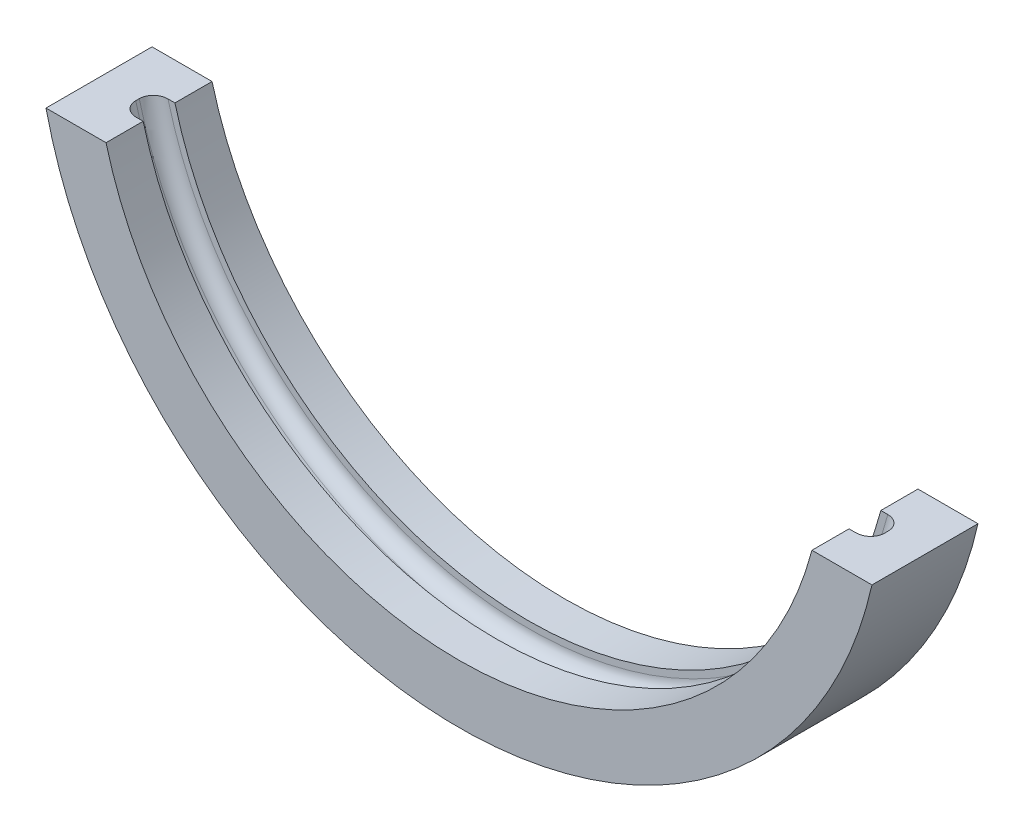
ISO-10303-21;
HEADER;
FILE_DESCRIPTION(('STEP AP214'),'2;1');
FILE_NAME('part.step','',(''),(''),'','','');
FILE_SCHEMA(('AUTOMOTIVE_DESIGN { 1 0 10303 214 1 1 1 1 }'));
ENDSEC;
DATA;
#1=APPLICATION_CONTEXT('core data for automotive mechanical design processes');
#2=APPLICATION_PROTOCOL_DEFINITION('international standard','automotive_design',2000,#1);
#3=PRODUCT_CONTEXT('',#1,'mechanical');
#4=PRODUCT('Part','Part','',(#3));
#5=PRODUCT_RELATED_PRODUCT_CATEGORY('part','',(#4));
#6=PRODUCT_DEFINITION_FORMATION('','',#4);
#7=PRODUCT_DEFINITION_CONTEXT('part definition',#1,'design');
#8=PRODUCT_DEFINITION('design','',#6,#7);
#9=PRODUCT_DEFINITION_SHAPE('','',#8);
#10=(LENGTH_UNIT() NAMED_UNIT(*) SI_UNIT(.MILLI.,.METRE.));
#11=(NAMED_UNIT(*) PLANE_ANGLE_UNIT() SI_UNIT($,.RADIAN.));
#12=(NAMED_UNIT(*) SI_UNIT($,.STERADIAN.) SOLID_ANGLE_UNIT());
#13=UNCERTAINTY_MEASURE_WITH_UNIT(LENGTH_MEASURE(1.E-05),#10,'distance_accuracy_value','');
#14=(GEOMETRIC_REPRESENTATION_CONTEXT(3) GLOBAL_UNCERTAINTY_ASSIGNED_CONTEXT((#13)) GLOBAL_UNIT_ASSIGNED_CONTEXT((#10,
#11,#12)) REPRESENTATION_CONTEXT('',''));
#15=CARTESIAN_POINT('',(0.,0.,0.));
#16=DIRECTION('',(0.,0.,1.));
#17=DIRECTION('',(1.,0.,0.));
#18=AXIS2_PLACEMENT_3D('',#15,#16,#17);
#19=CARTESIAN_POINT('',(0.,76.073,5.715));
#20=DIRECTION('',(0.,0.,-1.));
#21=DIRECTION('',(-1.,0.,0.));
#22=AXIS2_PLACEMENT_3D('',#19,#20,#21);
#23=CYLINDRICAL_SURFACE('',#22,76.073);
#24=CARTESIAN_POINT('',(0.,0.,1.33349999999999));
#25=CARTESIAN_POINT('',(0.0855945349997394,2.06101865915867E-07,1.33350379291589));
#26=CARTESIAN_POINT('',(0.171250915498614,0.000146012248360919,1.34073524768457));
#27=CARTESIAN_POINT('',(0.340204023150751,0.00071364506222568,1.36948225182749));
#28=CARTESIAN_POINT('',(0.423497794593289,0.00113580282824444,1.39101493604841));
#29=CARTESIAN_POINT('',(0.58525356893735,0.00220832220925467,1.44775060002442));
#30=CARTESIAN_POINT('',(0.663717883442069,0.00285857363366933,1.48294697981084));
#31=CARTESIAN_POINT('',(0.813602096244806,0.0043138981059449,1.56600169332678));
#32=CARTESIAN_POINT('',(0.885023725956289,0.00511893295668781,1.61385690423012));
#33=CARTESIAN_POINT('',(1.01883757249064,0.00679340697851409,1.72088761442366));
#34=CARTESIAN_POINT('',(1.08122770917481,0.00766286091714674,1.78006571434437));
#35=CARTESIAN_POINT('',(1.19519031708527,0.0093680471323975,1.90805861859076));
#36=CARTESIAN_POINT('',(1.24676236082598,0.010203778075371,1.97687380355443));
#37=CARTESIAN_POINT('',(1.3376251451231,0.0117473104519163,2.12219141461824));
#38=CARTESIAN_POINT('',(1.37691508154246,0.0124551035078293,2.19869434361906));
#39=CARTESIAN_POINT('',(1.44209293399731,0.0136628632197349,2.35721212766005));
#40=CARTESIAN_POINT('',(1.46798088892473,0.0141628304788274,2.43922696670414));
#41=CARTESIAN_POINT('',(1.50561666142446,0.0148984887564408,2.60642887018513));
#42=CARTESIAN_POINT('',(1.51736637556974,0.0151342152212277,2.69161550756052));
#43=CARTESIAN_POINT('',(1.52639796106279,0.0153149207245114,2.8627524189173));
#44=CARTESIAN_POINT('',(1.52367987260578,0.0152599005707755,2.94870269077645));
#45=CARTESIAN_POINT('',(1.50385466040848,0.0148653504340099,3.11891417148759));
#46=CARTESIAN_POINT('',(1.48674959902126,0.0145258612292591,3.20317562065764));
#47=CARTESIAN_POINT('',(1.43863917290202,0.0136007098296155,3.3676307436008));
#48=CARTESIAN_POINT('',(1.40763378638577,0.0130150472489263,3.44782441099877));
#49=CARTESIAN_POINT('',(1.33260048235792,0.0116635275432489,3.60187411392825));
#50=CARTESIAN_POINT('',(1.28857161888797,0.0108976573297322,3.67572968859041));
#51=CARTESIAN_POINT('',(1.18874191287519,0.00927207813996294,3.81500161578621));
#52=CARTESIAN_POINT('',(1.13294106097371,0.00841236908910922,3.88041796161065));
#53=CARTESIAN_POINT('',(1.01113968026977,0.00669585093085855,4.00096653225274));
#54=CARTESIAN_POINT('',(0.945137359360457,0.0058390423600706,4.05609694636289));
#55=CARTESIAN_POINT('',(0.804812955805773,0.00422506510297776,4.15449474589157));
#56=CARTESIAN_POINT('',(0.730490871968146,0.00346789643095172,4.19776212961007));
#57=CARTESIAN_POINT('',(0.575635722257035,0.00213855432188997,4.27120543008588));
#58=CARTESIAN_POINT('',(0.495102630444092,0.00156638165751761,4.30138129216468));
#59=CARTESIAN_POINT('',(0.330111987568197,0.000671548269268094,4.34778380786271));
#60=CARTESIAN_POINT('',(0.245654441366153,0.000348887236349569,4.3640104787592));
#61=CARTESIAN_POINT('',(0.0752280970382326,-1.05092405947312E-05,4.38205177674906));
#62=CARTESIAN_POINT('',(-0.0107404358431765,-4.72943757394238E-05,4.38386890851823));
#63=CARTESIAN_POINT('',(-0.181762198594427,0.000169076345192388,4.37304606986865));
#64=CARTESIAN_POINT('',(-0.266815428914038,0.000422232058788883,4.36040610655427));
#65=CARTESIAN_POINT('',(-0.433585227687398,0.0011899157446135,4.32102995718912));
#66=CARTESIAN_POINT('',(-0.515302064212906,0.00170442267303155,4.29429490605803));
#67=CARTESIAN_POINT('',(-0.673087615387558,0.00293681524962359,4.22748865692274));
#68=CARTESIAN_POINT('',(-0.749156325373015,0.00365470106572617,4.18741744790695));
#69=CARTESIAN_POINT('',(-0.893497817923817,0.00521306827912535,4.09506991635602));
#70=CARTESIAN_POINT('',(-0.961769521065522,0.00605356661440183,4.04279190694471));
#71=CARTESIAN_POINT('',(-1.08856816644544,0.00776235857443175,3.92751724418561));
#72=CARTESIAN_POINT('',(-1.14709509541133,0.00863065223704034,3.86452057623931));
#73=CARTESIAN_POINT('',(-1.25275113682792,0.0102972860680389,3.72958614285633));
#74=CARTESIAN_POINT('',(-1.2998786325906,0.0110956163038644,3.65764711138529));
#75=CARTESIAN_POINT('',(-1.38138693581098,0.012532160014725,3.50687658683567));
#76=CARTESIAN_POINT('',(-1.41576776354565,0.0131703737444674,3.4280451047216));
#77=CARTESIAN_POINT('',(-1.47080396987324,0.0142146587671107,3.26573353617285));
#78=CARTESIAN_POINT('',(-1.49146040078931,0.0146207478579197,3.18225380667632));
#79=CARTESIAN_POINT('',(-1.51846491163559,0.015155049642882,3.01301030152232));
#80=CARTESIAN_POINT('',(-1.52481298287515,0.0152832621682579,2.92724652447759));
#81=CARTESIAN_POINT('',(-1.5230204201675,0.0152473484650301,2.75588581915875));
#82=CARTESIAN_POINT('',(-1.51488234856612,0.0150832739369008,2.67028886405773));
#83=CARTESIAN_POINT('',(-1.4843537508379,0.0144813917127718,2.50167631198362));
#84=CARTESIAN_POINT('',(-1.46196319621411,0.0140435834694591,2.41866072017216));
#85=CARTESIAN_POINT('',(-1.40356528137836,0.0129435925449101,2.25756570290613));
#86=CARTESIAN_POINT('',(-1.36755767518963,0.0122814058105504,2.17948636664921));
#87=CARTESIAN_POINT('',(-1.28294952090296,0.0108073427394373,2.03048353282782));
#88=CARTESIAN_POINT('',(-1.23434944982934,0.00999547207330576,1.95955976433944));
#89=CARTESIAN_POINT('',(-1.12593166801518,0.00831346202115557,1.82687158382607));
#90=CARTESIAN_POINT('',(-1.06611316687766,0.00744331853229102,1.76510781772051));
#91=CARTESIAN_POINT('',(-0.936938606354715,0.00574266821983038,1.65248329537931));
#92=CARTESIAN_POINT('',(-0.867580184106196,0.00491217128481854,1.60162524830068));
#93=CARTESIAN_POINT('',(-0.721275855637611,0.00338424251398353,1.51225182287018));
#94=CARTESIAN_POINT('',(-0.644325772223447,0.00268688456219293,1.47374328973678));
#95=CARTESIAN_POINT('',(-0.485111216277927,0.00150529078577328,1.41023637854843));
#96=CARTESIAN_POINT('',(-0.402853232344317,0.00102080019868899,1.38522184248434));
#97=CARTESIAN_POINT('',(-0.266727553014035,0.00044943552346389,1.35606306091305));
#98=CARTESIAN_POINT('',(-0.213743956090708,0.000281625570785505,1.34761251136189));
#99=CARTESIAN_POINT('',(-0.10718165758212,5.68432813400188E-05,1.33632979362654));
#100=CARTESIAN_POINT('',(-0.0536029560740152,-1.29069797102052E-07,1.33349762471394));
#101=CARTESIAN_POINT('',(0.,0.,1.33349999999999));
#102=B_SPLINE_CURVE_WITH_KNOTS('',3,(#24,#25,#26,#27,#28,#29,#30,#31,#32,#33,#34,#35,#36,#37,
#38,#39,#40,#41,#42,#43,#44,#45,#46,#47,#48,#49,#50,#51,#52,#53,#54,#55,#56,#57,#58,#59,#60,#61,
#62,#63,#64,#65,#66,#67,#68,#69,#70,#71,#72,#73,#74,#75,#76,#77,#78,#79,#80,#81,#82,#83,#84,#85,
#86,#87,#88,#89,#90,#91,#92,#93,#94,#95,#96,#97,#98,#99,#100,#101),.UNSPECIFIED.,.T.,.F.,(4,2,2,
2,2,2,2,2,2,2,2,2,2,2,2,2,2,2,2,2,2,2,2,2,2,2,2,2,2,2,2,2,2,2,2,2,2,2,4),(0.,0.256587951195914,
0.513483886104433,0.770255886772825,1.02696460294593,1.28373235066598,1.5405102428578,
1.79730494335351,2.0540988986388,2.31085840248152,2.56761719298187,2.82433918372928,
3.08106157680606,3.33780262145724,3.59454387021671,3.85133027245316,4.10811671148822,
4.36490422301619,4.62169141649049,4.87843397406325,5.13517640547004,5.3918981674388,
5.64862014138162,5.90537761313974,6.16213543459716,6.41892964858623,6.67572345407407,
6.9324975675299,7.18927183694585,7.44600069198828,7.70273006034533,7.95946406645213,
8.21618834845273,8.47293072481965,8.72973680644864,8.98668498820558,9.2433248077216,
9.40401117000277,9.56469751145107),.UNSPECIFIED.);
#103=CARTESIAN_POINT('',(0.,0.,1.33349999999999));
#104=VERTEX_POINT('',#103);
#105=EDGE_CURVE('E173',#104,#104,#102,.T.);
#106=ORIENTED_EDGE('',*,*,#105,.F.);
#107=EDGE_LOOP('',(#106));
#108=FACE_BOUND('',#107,.T.);
#109=CARTESIAN_POINT('',(0.,76.073,12.3825));
#110=DIRECTION('',(0.,0.,1.));
#111=DIRECTION('',(1.,0.,0.));
#112=AXIS2_PLACEMENT_3D('',#109,#110,#111);
#113=CIRCLE('',#112,76.073);
#114=CARTESIAN_POINT('',(-74.2028950446005,59.3090000000001,12.3825));
#115=VERTEX_POINT('',#114);
#116=CARTESIAN_POINT('',(74.2028950446005,59.309,12.3825));
#117=VERTEX_POINT('',#116);
#118=EDGE_CURVE('E156',#115,#117,#113,.T.);
#119=ORIENTED_EDGE('',*,*,#118,.F.);
#120=DIRECTION('',(0.,0.,1.));
#121=VECTOR('',#120,1.);
#122=CARTESIAN_POINT('',(-74.2028950446005,59.3090000000001,-6.6675));
#123=LINE('',#122,#121);
#124=CARTESIAN_POINT('',(-74.2028950446005,59.3090000000001,-6.6675));
#125=VERTEX_POINT('',#124);
#126=EDGE_CURVE('E128',#125,#115,#123,.T.);
#127=ORIENTED_EDGE('',*,*,#126,.F.);
#128=CARTESIAN_POINT('',(0.,76.073,-6.6675));
#129=DIRECTION('',(0.,0.,-1.));
#130=DIRECTION('',(-1.,0.,0.));
#131=AXIS2_PLACEMENT_3D('',#128,#129,#130);
#132=CIRCLE('',#131,76.073);
#133=CARTESIAN_POINT('',(74.2028950446005,59.309,-6.6675));
#134=VERTEX_POINT('',#133);
#135=EDGE_CURVE('E138',#134,#125,#132,.T.);
#136=ORIENTED_EDGE('',*,*,#135,.F.);
#137=DIRECTION('',(0.,0.,1.));
#138=VECTOR('',#137,1.);
#139=CARTESIAN_POINT('',(74.2028950446005,59.309,-6.6675));
#140=LINE('',#139,#138);
#141=EDGE_CURVE('E227',#134,#117,#140,.T.);
#142=ORIENTED_EDGE('',*,*,#141,.T.);
#143=EDGE_LOOP('',(#119,#127,#136,#142));
#144=FACE_BOUND('',#143,.T.);
#145=ADVANCED_FACE('F38',(#108,#144),#23,.T.);
#146=CARTESIAN_POINT('',(0.,76.073,5.715));
#147=DIRECTION('',(0.,0.,-1.));
#148=DIRECTION('',(-1.,0.,0.));
#149=AXIS2_PLACEMENT_3D('',#146,#147,#148);
#150=CYLINDRICAL_SURFACE('',#149,69.342);
#151=DIRECTION('',(0.,0.,-1.));
#152=VECTOR('',#151,1.);
#153=CARTESIAN_POINT('',(-67.2850746302626,59.3090000000001,5.715));
#154=LINE('',#153,#152);
#155=CARTESIAN_POINT('',(-67.2850746302626,59.3090000000001,3.175));
#156=VERTEX_POINT('',#155);
#157=CARTESIAN_POINT('',(-67.2850746302626,59.3090000000001,2.54));
#158=VERTEX_POINT('',#157);
#159=EDGE_CURVE('E66',#156,#158,#154,.T.);
#160=ORIENTED_EDGE('',*,*,#159,.F.);
#161=CARTESIAN_POINT('',(0.,76.073,3.175));
#162=DIRECTION('',(0.,0.,1.));
#163=DIRECTION('',(1.,0.,0.));
#164=AXIS2_PLACEMENT_3D('',#161,#162,#163);
#165=CIRCLE('',#164,69.342);
#166=CARTESIAN_POINT('',(67.2850746302626,59.309,3.175));
#167=VERTEX_POINT('',#166);
#168=EDGE_CURVE('E164',#156,#167,#165,.T.);
#169=ORIENTED_EDGE('',*,*,#168,.T.);
#170=DIRECTION('',(0.,0.,-1.));
#171=VECTOR('',#170,1.);
#172=CARTESIAN_POINT('',(67.2850746302626,59.309,5.715));
#173=LINE('',#172,#171);
#174=CARTESIAN_POINT('',(67.2850746302667,59.309,2.53999999999952));
#175=VERTEX_POINT('',#174);
#176=EDGE_CURVE('E242',#167,#175,#173,.T.);
#177=ORIENTED_EDGE('',*,*,#176,.T.);
#178=CARTESIAN_POINT('',(0.,76.073,2.54));
#179=DIRECTION('',(0.,0.,-1.));
#180=DIRECTION('',(-1.,0.,0.));
#181=AXIS2_PLACEMENT_3D('',#178,#179,#180);
#182=CIRCLE('',#181,69.342);
#183=EDGE_CURVE('E159',#175,#158,#182,.T.);
#184=ORIENTED_EDGE('',*,*,#183,.T.);
#185=EDGE_LOOP('',(#160,#169,#177,#184));
#186=FACE_BOUND('',#185,.T.);
#187=ADVANCED_FACE('F210',(#186),#150,.F.);
#188=CARTESIAN_POINT('',(0.,0.,5.715));
#189=DIRECTION('',(0.,0.,1.));
#190=DIRECTION('',(1.,0.,0.));
#191=AXIS2_PLACEMENT_3D('',#188,#189,#190);
#192=PLANE('',#191);
#193=CARTESIAN_POINT('',(0.,76.073,5.715));
#194=DIRECTION('',(0.,0.,1.));
#195=DIRECTION('',(1.,0.,0.));
#196=AXIS2_PLACEMENT_3D('',#193,#194,#195);
#197=CIRCLE('',#196,66.802);
#198=CARTESIAN_POINT('',(64.6643294869745,59.309,5.715));
#199=VERTEX_POINT('',#198);
#200=CARTESIAN_POINT('',(-64.6643294869745,59.3090000000001,5.715));
#201=VERTEX_POINT('',#200);
#202=EDGE_CURVE('E167',#199,#201,#197,.F.);
#203=ORIENTED_EDGE('',*,*,#202,.T.);
#204=DIRECTION('',(1.,0.,0.));
#205=VECTOR('',#204,1.);
#206=CARTESIAN_POINT('',(0.,59.3090000000001,5.715));
#207=LINE('',#206,#205);
#208=CARTESIAN_POINT('',(-63.4171737327516,59.3090000000001,5.715));
#209=VERTEX_POINT('',#208);
#210=EDGE_CURVE('E267',#201,#209,#207,.T.);
#211=ORIENTED_EDGE('',*,*,#210,.T.);
#212=CARTESIAN_POINT('',(0.,76.073,5.715));
#213=DIRECTION('',(0.,0.,1.));
#214=DIRECTION('',(1.,0.,0.));
#215=AXIS2_PLACEMENT_3D('',#212,#213,#214);
#216=CIRCLE('',#215,65.5955);
#217=CARTESIAN_POINT('',(63.4171737327516,59.309,5.715));
#218=VERTEX_POINT('',#217);
#219=EDGE_CURVE('E146',#209,#218,#216,.T.);
#220=ORIENTED_EDGE('',*,*,#219,.T.);
#221=DIRECTION('',(-1.,0.,0.));
#222=VECTOR('',#221,1.);
#223=CARTESIAN_POINT('',(0.,59.309,5.715));
#224=LINE('',#223,#222);
#225=EDGE_CURVE('E250',#199,#218,#224,.T.);
#226=ORIENTED_EDGE('',*,*,#225,.F.);
#227=EDGE_LOOP('',(#203,#211,#220,#226));
#228=FACE_BOUND('',#227,.T.);
#229=ADVANCED_FACE('F208',(#228),#192,.F.);
#230=CARTESIAN_POINT('',(0.,76.073,12.3825));
#231=DIRECTION('',(0.,0.,-1.));
#232=DIRECTION('',(-1.,0.,0.));
#233=AXIS2_PLACEMENT_3D('',#230,#231,#232);
#234=CYLINDRICAL_SURFACE('',#233,65.5955);
#235=DIRECTION('',(0.,0.,1.));
#236=VECTOR('',#235,1.);
#237=CARTESIAN_POINT('',(-63.4171737327516,59.3090000000001,-6.6675));
#238=LINE('',#237,#236);
#239=CARTESIAN_POINT('',(-63.4171737327516,59.3090000000001,12.3825));
#240=VERTEX_POINT('',#239);
#241=EDGE_CURVE('E129',#209,#240,#238,.T.);
#242=ORIENTED_EDGE('',*,*,#241,.T.);
#243=CARTESIAN_POINT('',(0.,76.073,12.3825));
#244=DIRECTION('',(0.,0.,1.));
#245=DIRECTION('',(1.,0.,0.));
#246=AXIS2_PLACEMENT_3D('',#243,#244,#245);
#247=CIRCLE('',#246,65.5955);
#248=CARTESIAN_POINT('',(63.4171737327516,59.309,12.3825));
#249=VERTEX_POINT('',#248);
#250=EDGE_CURVE('E153',#240,#249,#247,.T.);
#251=ORIENTED_EDGE('',*,*,#250,.T.);
#252=DIRECTION('',(0.,0.,1.));
#253=VECTOR('',#252,1.);
#254=CARTESIAN_POINT('',(63.4171737327516,59.309,-6.6675));
#255=LINE('',#254,#253);
#256=EDGE_CURVE('E233',#218,#249,#255,.T.);
#257=ORIENTED_EDGE('',*,*,#256,.F.);
#258=ORIENTED_EDGE('',*,*,#219,.F.);
#259=EDGE_LOOP('',(#242,#251,#257,#258));
#260=FACE_BOUND('',#259,.T.);
#261=ADVANCED_FACE('F206',(#260),#234,.F.);
#262=CARTESIAN_POINT('',(0.,0.,12.3825));
#263=DIRECTION('',(0.,0.,1.));
#264=DIRECTION('',(1.,0.,0.));
#265=AXIS2_PLACEMENT_3D('',#262,#263,#264);
#266=PLANE('',#265);
#267=DIRECTION('',(1.,0.,0.));
#268=VECTOR('',#267,1.);
#269=CARTESIAN_POINT('',(0.,59.3090000000001,12.3825));
#270=LINE('',#269,#268);
#271=EDGE_CURVE('E139',#115,#240,#270,.T.);
#272=ORIENTED_EDGE('',*,*,#271,.F.);
#273=ORIENTED_EDGE('',*,*,#118,.T.);
#274=DIRECTION('',(-1.,0.,0.));
#275=VECTOR('',#274,1.);
#276=CARTESIAN_POINT('',(0.,59.309,12.3825));
#277=LINE('',#276,#275);
#278=EDGE_CURVE('E231',#117,#249,#277,.T.);
#279=ORIENTED_EDGE('',*,*,#278,.T.);
#280=ORIENTED_EDGE('',*,*,#250,.F.);
#281=EDGE_LOOP('',(#272,#273,#279,#280));
#282=FACE_BOUND('',#281,.T.);
#283=ADVANCED_FACE('F200',(#282),#266,.T.);
#284=CARTESIAN_POINT('',(0.,0.,0.));
#285=DIRECTION('',(0.,0.,-1.));
#286=DIRECTION('',(-1.,0.,0.));
#287=AXIS2_PLACEMENT_3D('',#284,#285,#286);
#288=PLANE('',#287);
#289=CARTESIAN_POINT('',(0.,76.073,0.));
#290=DIRECTION('',(0.,0.,-1.));
#291=DIRECTION('',(-1.,0.,0.));
#292=AXIS2_PLACEMENT_3D('',#289,#290,#291);
#293=CIRCLE('',#292,65.5955);
#294=CARTESIAN_POINT('',(63.4171737327516,59.309,0.));
#295=VERTEX_POINT('',#294);
#296=CARTESIAN_POINT('',(-63.4171737327516,59.3090000000001,0.));
#297=VERTEX_POINT('',#296);
#298=EDGE_CURVE('E144',#295,#297,#293,.T.);
#299=ORIENTED_EDGE('',*,*,#298,.T.);
#300=DIRECTION('',(-1.,0.,0.));
#301=VECTOR('',#300,1.);
#302=CARTESIAN_POINT('',(0.,59.3090000000001,0.));
#303=LINE('',#302,#301);
#304=CARTESIAN_POINT('',(-64.6643294869745,59.3090000000001,0.));
#305=VERTEX_POINT('',#304);
#306=EDGE_CURVE('E123',#297,#305,#303,.T.);
#307=ORIENTED_EDGE('',*,*,#306,.T.);
#308=CARTESIAN_POINT('',(0.,76.073,0.));
#309=DIRECTION('',(0.,0.,-1.));
#310=DIRECTION('',(-1.,0.,0.));
#311=AXIS2_PLACEMENT_3D('',#308,#309,#310);
#312=CIRCLE('',#311,66.802);
#313=CARTESIAN_POINT('',(64.6643294869745,59.309,0.));
#314=VERTEX_POINT('',#313);
#315=EDGE_CURVE('E170',#305,#314,#312,.F.);
#316=ORIENTED_EDGE('',*,*,#315,.T.);
#317=DIRECTION('',(1.,0.,0.));
#318=VECTOR('',#317,1.);
#319=CARTESIAN_POINT('',(0.,59.309,0.));
#320=LINE('',#319,#318);
#321=EDGE_CURVE('E58',#295,#314,#320,.T.);
#322=ORIENTED_EDGE('',*,*,#321,.F.);
#323=EDGE_LOOP('',(#299,#307,#316,#322));
#324=FACE_BOUND('',#323,.T.);
#325=ADVANCED_FACE('F197',(#324),#288,.F.);
#326=CARTESIAN_POINT('',(0.,76.073,-6.6675));
#327=DIRECTION('',(0.,0.,1.));
#328=DIRECTION('',(1.,0.,0.));
#329=AXIS2_PLACEMENT_3D('',#326,#327,#328);
#330=CYLINDRICAL_SURFACE('',#329,65.5955);
#331=CARTESIAN_POINT('',(-63.4171737327516,59.3090000000001,-6.6675));
#332=VERTEX_POINT('',#331);
#333=EDGE_CURVE('E117',#332,#297,#238,.T.);
#334=ORIENTED_EDGE('',*,*,#333,.T.);
#335=ORIENTED_EDGE('',*,*,#298,.F.);
#336=CARTESIAN_POINT('',(63.4171737327516,59.309,-6.6675));
#337=VERTEX_POINT('',#336);
#338=EDGE_CURVE('E143',#337,#295,#255,.T.);
#339=ORIENTED_EDGE('',*,*,#338,.F.);
#340=CARTESIAN_POINT('',(0.,76.073,-6.6675));
#341=DIRECTION('',(0.,0.,-1.));
#342=DIRECTION('',(-1.,0.,0.));
#343=AXIS2_PLACEMENT_3D('',#340,#341,#342);
#344=CIRCLE('',#343,65.5955);
#345=EDGE_CURVE('E136',#337,#332,#344,.T.);
#346=ORIENTED_EDGE('',*,*,#345,.T.);
#347=EDGE_LOOP('',(#334,#335,#339,#346));
#348=FACE_BOUND('',#347,.T.);
#349=ADVANCED_FACE('F142',(#348),#330,.F.);
#350=CARTESIAN_POINT('',(0.,0.,-6.6675));
#351=DIRECTION('',(0.,0.,-1.));
#352=DIRECTION('',(-1.,0.,0.));
#353=AXIS2_PLACEMENT_3D('',#350,#351,#352);
#354=PLANE('',#353);
#355=DIRECTION('',(1.,0.,0.));
#356=VECTOR('',#355,1.);
#357=CARTESIAN_POINT('',(0.,59.3090000000001,-6.6675));
#358=LINE('',#357,#356);
#359=EDGE_CURVE('E120',#125,#332,#358,.T.);
#360=ORIENTED_EDGE('',*,*,#359,.T.);
#361=ORIENTED_EDGE('',*,*,#345,.F.);
#362=DIRECTION('',(-1.,0.,0.));
#363=VECTOR('',#362,1.);
#364=CARTESIAN_POINT('',(0.,59.309,-6.6675));
#365=LINE('',#364,#363);
#366=EDGE_CURVE('E237',#134,#337,#365,.T.);
#367=ORIENTED_EDGE('',*,*,#366,.F.);
#368=ORIENTED_EDGE('',*,*,#135,.T.);
#369=EDGE_LOOP('',(#360,#361,#367,#368));
#370=FACE_BOUND('',#369,.T.);
#371=ADVANCED_FACE('F134',(#370),#354,.T.);
#372=CARTESIAN_POINT('',(0.,76.073,3.175));
#373=DIRECTION('',(0.,0.,1.));
#374=DIRECTION('',(1.,0.,0.));
#375=AXIS2_PLACEMENT_3D('',#372,#373,#374);
#376=TOROIDAL_SURFACE('',#375,66.802,2.54);
#377=ORIENTED_EDGE('',*,*,#168,.F.);
#378=CARTESIAN_POINT('',(-67.1962838107211,59.3090000000001,3.83092536114212));
#379=CARTESIAN_POINT('',(-67.1586459510393,59.3090000000001,3.96751543139975));
#380=CARTESIAN_POINT('',(-67.1092377944369,59.3090000000001,4.10098253554627));
#381=CARTESIAN_POINT('',(-66.9885032175229,59.3090000000001,4.35774480129858));
#382=CARTESIAN_POINT('',(-66.9171459639937,59.3090000000001,4.48102534219031));
#383=CARTESIAN_POINT('',(-66.7549581214165,59.3090000000001,4.7137413125856));
#384=CARTESIAN_POINT('',(-66.6641580391925,59.3090000000001,4.82319800953284));
#385=CARTESIAN_POINT('',(-66.4658315776287,59.3090000000001,5.02564411786047));
#386=CARTESIAN_POINT('',(-66.3583089189339,59.3090000000001,5.11863718245511));
#387=CARTESIAN_POINT('',(-66.1273510769363,59.3090000000001,5.28763859661737));
#388=CARTESIAN_POINT('',(-66.0036419205189,59.3090000000001,5.36327231277366));
#389=CARTESIAN_POINT('',(-65.7455577525257,59.3090000000001,5.49338942890486));
#390=CARTESIAN_POINT('',(-65.6111807512289,59.3090000000001,5.54786887205905));
#391=CARTESIAN_POINT('',(-65.3313414323431,59.3090000000001,5.63576239727172));
#392=CARTESIAN_POINT('',(-65.1856691382671,59.3090000000001,5.66850839888705));
#393=CARTESIAN_POINT('',(-64.8909199078622,59.3090000000001,5.70961645619918));
#394=CARTESIAN_POINT('',(-64.7418425296595,59.3090000000001,5.71797532888034));
#395=CARTESIAN_POINT('',(-64.4413233335989,59.3090000000001,5.71007297049496));
#396=CARTESIAN_POINT('',(-64.2898943974632,59.3090000000001,5.69331227503087));
#397=CARTESIAN_POINT('',(-63.9919739572796,59.3090000000001,5.6346555995963));
#398=CARTESIAN_POINT('',(-63.8454826795893,59.3090000000001,5.59275846894454));
#399=CARTESIAN_POINT('',(-63.561464136536,59.3090000000001,5.48474353106785));
#400=CARTESIAN_POINT('',(-63.4239498334207,59.3090000000001,5.41859157437825));
#401=CARTESIAN_POINT('',(-63.1622782412433,59.3090000000001,5.26369542245273));
#402=CARTESIAN_POINT('',(-63.0381198700193,59.3090000000001,5.17495305956477));
#403=CARTESIAN_POINT('',(-62.809428890784,59.3090000000001,4.97914618586633));
#404=CARTESIAN_POINT('',(-62.7045569551246,59.3090000000001,4.87247837252958));
#405=CARTESIAN_POINT('',(-62.5149520800424,59.3090000000001,4.64252704946314));
#406=CARTESIAN_POINT('',(-62.4302152102532,59.3090000000001,4.51924678985908));
#407=CARTESIAN_POINT('',(-62.2862841064959,59.3090000000001,4.2639245421511));
#408=CARTESIAN_POINT('',(-62.2263400537842,59.3090000000001,4.13230525769864));
#409=CARTESIAN_POINT('',(-62.130187244569,59.3090000000001,3.86066603256426));
#410=CARTESIAN_POINT('',(-62.0939737791023,59.3090000000001,3.72064776455197));
#411=CARTESIAN_POINT('',(-62.0473139698193,59.3090000000001,3.44073732980858));
#412=CARTESIAN_POINT('',(-62.0361227575236,59.3090000000001,3.30096896154178));
#413=CARTESIAN_POINT('',(-62.0376894095757,59.3090000000001,3.02157388398892));
#414=CARTESIAN_POINT('',(-62.0504449359104,59.3090000000001,2.88194716220505));
#415=CARTESIAN_POINT('',(-62.0991471916397,59.3090000000001,2.60859116080896));
#416=CARTESIAN_POINT('',(-62.1348061465988,59.3090000000001,2.47481040476093));
#417=CARTESIAN_POINT('',(-62.2278389893505,59.3090000000001,2.21503638288399));
#418=CARTESIAN_POINT('',(-62.2852135290166,59.3090000000001,2.0890433509645));
#419=CARTESIAN_POINT('',(-62.420574188058,59.3090000000001,1.84684474078872));
#420=CARTESIAN_POINT('',(-62.4987810519718,59.3090000000001,1.73076269286261));
#421=CARTESIAN_POINT('',(-62.6730681081947,59.3090000000001,1.51290921031465));
#422=CARTESIAN_POINT('',(-62.7691505496736,59.3090000000001,1.41113957936554));
#423=CARTESIAN_POINT('',(-62.9793458776707,59.3090000000001,1.22166543768013));
#424=CARTESIAN_POINT('',(-63.0938949223404,59.3090000000001,1.13444497307823));
#425=CARTESIAN_POINT('',(-63.3356237987961,59.3090000000001,0.97974881461388));
#426=CARTESIAN_POINT('',(-63.4628057296653,59.3090000000001,0.912276409468944));
#427=CARTESIAN_POINT('',(-63.7306690535596,59.3090000000001,0.79670769712523));
#428=CARTESIAN_POINT('',(-63.8716566574005,59.3090000000001,0.749320698176571));
#429=CARTESIAN_POINT('',(-64.1594943652873,59.3090000000001,0.678291546174374));
#430=CARTESIAN_POINT('',(-64.3063452860156,59.3090000000001,0.654652713006703));
#431=CARTESIAN_POINT('',(-64.6053267330671,59.3090000000001,0.631404574605055));
#432=CARTESIAN_POINT('',(-64.7575012196877,59.3090000000001,0.632356765721894));
#433=CARTESIAN_POINT('',(-65.0595586764653,59.3090000000001,0.65969566428782));
#434=CARTESIAN_POINT('',(-65.2094415179537,59.3090000000001,0.68608379459575));
#435=CARTESIAN_POINT('',(-65.5031174686816,59.3090000000001,0.763851498470957));
#436=CARTESIAN_POINT('',(-65.6468891201507,59.3090000000001,0.815312307066762));
#437=CARTESIAN_POINT('',(-65.9235351644215,59.3090000000001,0.942050518025905));
#438=CARTESIAN_POINT('',(-66.0564102955429,59.3090000000001,1.01732630506634));
#439=CARTESIAN_POINT('',(-66.3049636510927,59.3090000000001,1.18830362697307));
#440=CARTESIAN_POINT('',(-66.4208972532742,59.3090000000001,1.28363357077124));
#441=CARTESIAN_POINT('',(-66.6345049937115,59.3090000000001,1.4929323809666));
#442=CARTESIAN_POINT('',(-66.7321828612555,59.3090000000001,1.60689743163915));
#443=CARTESIAN_POINT('',(-66.9034253509819,59.3090000000001,1.84665037310296));
#444=CARTESIAN_POINT('',(-66.9776143310163,59.3090000000001,1.9719923094687));
#445=CARTESIAN_POINT('',(-67.103203371922,59.3090000000001,2.23366243604048));
#446=CARTESIAN_POINT('',(-67.1546014153248,59.3090000000001,2.36999159758096));
#447=CARTESIAN_POINT('',(-67.2317040313438,59.3090000000001,2.6456290052178));
#448=CARTESIAN_POINT('',(-67.2580822567871,59.3090000000001,2.78474948951182));
#449=CARTESIAN_POINT('',(-67.2866541645217,59.3090000000001,3.06532434047783));
#450=CARTESIAN_POINT('',(-67.2888817148623,59.3090000000001,3.20677516010311));
#451=CARTESIAN_POINT('',(-67.2733256963492,59.3090000000001,3.42900603647518));
#452=CARTESIAN_POINT('',(-67.263519928561,59.3090000000001,3.51042412966468));
#453=CARTESIAN_POINT('',(-67.235882989623,59.3090000000001,3.67188479358976));
#454=CARTESIAN_POINT('',(-67.2180519709625,59.3090000000001,3.7519273904314));
#455=CARTESIAN_POINT('',(-67.1962838107211,59.3090000000001,3.83092536114212));
#456=B_SPLINE_CURVE_WITH_KNOTS('',3,(#378,#379,#380,#381,#382,#383,#384,#385,#386,#387,#388,
#389,#390,#391,#392,#393,#394,#395,#396,#397,#398,#399,#400,#401,#402,#403,#404,#405,#406,#407,
#408,#409,#410,#411,#412,#413,#414,#415,#416,#417,#418,#419,#420,#421,#422,#423,#424,#425,#426,
#427,#428,#429,#430,#431,#432,#433,#434,#435,#436,#437,#438,#439,#440,#441,#442,#443,#444,#445,
#446,#447,#448,#449,#450,#451,#452,#453,#454,#455),.UNSPECIFIED.,.T.,.F.,(4,2,2,2,2,2,2,2,2,2,2,
2,2,2,2,2,2,2,2,2,2,2,2,2,2,2,2,2,2,2,2,2,2,2,2,2,2,2,4),(0.,0.424734142150405,0.85006768003231,
1.27473867443505,1.69931531761006,2.1323371647875,2.56543996796917,3.01130577368562,
3.45722977134263,3.91213869830378,4.36706845141328,4.8226411957862,5.27817699961274,
5.7247113804644,6.17115852603411,6.60289103433718,7.03453784612422,7.45315387518392,
7.87172903526143,8.28514516350887,8.69857370295453,9.11657046014592,9.53461984681699,
9.96459474678002,10.3946412113668,10.8388145658013,11.2830500050194,11.7374376264557,
12.1918506673178,12.6477458886735,13.1036101941848,13.5516732864564,13.9996447479489,
14.4344493287447,14.8692923910423,15.2920640135454,15.7142426793226,15.9598957695705,
16.2055441923157),.UNSPECIFIED.);
#457=EDGE_CURVE('E261',#156,#201,#456,.T.);
#458=ORIENTED_EDGE('',*,*,#457,.T.);
#459=ORIENTED_EDGE('',*,*,#202,.F.);
#460=CARTESIAN_POINT('',(64.0188804179713,59.309,5.63700717406568));
#461=CARTESIAN_POINT('',(63.8740249388266,59.309,5.60145119562389));
#462=CARTESIAN_POINT('',(63.7320237433667,59.309,5.55384622467667));
#463=CARTESIAN_POINT('',(63.457815280131,59.309,5.43560098606477));
#464=CARTESIAN_POINT('',(63.3256187353155,59.309,5.36493594146944));
#465=CARTESIAN_POINT('',(63.0749491657338,59.309,5.20221017751559));
#466=CARTESIAN_POINT('',(62.956485782914,59.309,5.11013456066649));
#467=CARTESIAN_POINT('',(62.7371777668809,59.309,4.90699266951192));
#468=CARTESIAN_POINT('',(62.6363274362989,59.309,4.79593255928925));
#469=CARTESIAN_POINT('',(62.4576551377777,59.309,4.56055587183947));
#470=CARTESIAN_POINT('',(62.3793644070262,59.309,4.43659544973643));
#471=CARTESIAN_POINT('',(62.245538881323,59.309,4.17693762598439));
#472=CARTESIAN_POINT('',(62.1900003039396,59.309,4.04124217977084));
#473=CARTESIAN_POINT('',(62.1051333196422,59.309,3.76683422463271));
#474=CARTESIAN_POINT('',(62.0749950873345,59.309,3.62837191307636));
#475=CARTESIAN_POINT('',(62.0389374879877,59.309,3.34833484393667));
#476=CARTESIAN_POINT('',(62.0330145274632,59.309,3.20676055129867));
#477=CARTESIAN_POINT('',(62.0454622334575,59.309,2.92761826077109));
#478=CARTESIAN_POINT('',(62.0633356159053,59.309,2.79002776232365));
#479=CARTESIAN_POINT('',(62.1218893322575,59.309,2.5197984841452));
#480=CARTESIAN_POINT('',(62.1625692268637,59.309,2.3871596090887));
#481=CARTESIAN_POINT('',(62.2654800795824,59.309,2.1302188263621));
#482=CARTESIAN_POINT('',(62.3277558238493,59.309,2.00593488995127));
#483=CARTESIAN_POINT('',(62.4718388936273,59.309,1.7692693954567));
#484=CARTESIAN_POINT('',(62.5536480811981,59.309,1.65688897357169));
#485=CARTESIAN_POINT('',(62.7364051894461,59.309,1.4443909563215));
#486=CARTESIAN_POINT('',(62.8377504215357,59.309,1.34461530614715));
#487=CARTESIAN_POINT('',(63.0552829060173,59.309,1.16283545270903));
#488=CARTESIAN_POINT('',(63.1714724944444,59.309,1.08083405204205));
#489=CARTESIAN_POINT('',(63.4194859784989,59.309,0.934079805755831));
#490=CARTESIAN_POINT('',(63.551698835817,59.309,0.869984211589457));
#491=CARTESIAN_POINT('',(63.8248035643155,59.309,0.76419942262661));
#492=CARTESIAN_POINT('',(63.9656968097083,59.309,0.722513785814409));
#493=CARTESIAN_POINT('',(64.2564309285774,59.309,0.661629158348924));
#494=CARTESIAN_POINT('',(64.4064121382057,59.309,0.643098866443453));
#495=CARTESIAN_POINT('',(64.7073788298349,59.309,0.631160421585106));
#496=CARTESIAN_POINT('',(64.8583644049083,59.309,0.637754630172197));
#497=CARTESIAN_POINT('',(65.1588725607604,59.309,0.676178019281202));
#498=CARTESIAN_POINT('',(65.3083582921274,59.309,0.708296820156321));
#499=CARTESIAN_POINT('',(65.5997323357248,59.309,0.79741597133882));
#500=CARTESIAN_POINT('',(65.7416208027751,59.309,0.854415814394233));
#501=CARTESIAN_POINT('',(66.0122009554136,59.309,0.991255257522084));
#502=CARTESIAN_POINT('',(66.1410076629765,59.309,1.07086711501221));
#503=CARTESIAN_POINT('',(66.3829612816752,59.309,1.25112753548606));
#504=CARTESIAN_POINT('',(66.4961103050952,59.309,1.35177325630978));
#505=CARTESIAN_POINT('',(66.7003307705232,59.309,1.56849044590767));
#506=CARTESIAN_POINT('',(66.7918995310832,59.309,1.68409307637132));
#507=CARTESIAN_POINT('',(66.9536070999578,59.309,1.9294284599903));
#508=CARTESIAN_POINT('',(67.0237498267579,59.309,2.05915862354727));
#509=CARTESIAN_POINT('',(67.1384072791909,59.309,2.32483010832811));
#510=CARTESIAN_POINT('',(67.1836335595422,59.309,2.46046450681496));
#511=CARTESIAN_POINT('',(67.2501091656269,59.309,2.73748428152201));
#512=CARTESIAN_POINT('',(67.2713619484608,59.309,2.8788688254946));
#513=CARTESIAN_POINT('',(67.2889673423044,59.309,3.16011750931259));
#514=CARTESIAN_POINT('',(67.2858452848017,59.309,3.29994902048614));
#515=CARTESIAN_POINT('',(67.2560539731032,59.309,3.57707364958544));
#516=CARTESIAN_POINT('',(67.2293858730677,59.309,3.7143668915932));
#517=CARTESIAN_POINT('',(67.1535545671256,59.309,3.98194272415137));
#518=CARTESIAN_POINT('',(67.1044884656926,59.309,4.11225289178348));
#519=CARTESIAN_POINT('',(66.9854686147826,59.309,4.36294693546671));
#520=CARTESIAN_POINT('',(66.9155137956087,59.309,4.48333030277019));
#521=CARTESIAN_POINT('',(66.7557561695375,59.309,4.71263360969164));
#522=CARTESIAN_POINT('',(66.6656882886425,59.309,4.82136870837665));
#523=CARTESIAN_POINT('',(66.4690120902393,59.309,5.02265855706633));
#524=CARTESIAN_POINT('',(66.3624024384794,59.309,5.11521200058415));
#525=CARTESIAN_POINT('',(66.1326575769457,59.309,5.28417776357013));
#526=CARTESIAN_POINT('',(66.0091574137727,59.309,5.36009367556306));
#527=CARTESIAN_POINT('',(65.7514137449272,59.309,5.4908179984802));
#528=CARTESIAN_POINT('',(65.617166072686,59.309,5.54561817497887));
#529=CARTESIAN_POINT('',(65.3374930207951,59.309,5.63419586653578));
#530=CARTESIAN_POINT('',(65.191853557015,59.309,5.6672966637325));
#531=CARTESIAN_POINT('',(64.8972262721731,59.309,5.70907140573965));
#532=CARTESIAN_POINT('',(64.748241969993,59.309,5.71776991081358));
#533=CARTESIAN_POINT('',(64.5018077812067,59.309,5.7118962523225));
#534=CARTESIAN_POINT('',(64.4041395998084,59.309,5.70425859154907));
#535=CARTESIAN_POINT('',(64.210198137713,59.309,5.67847885779604));
#536=CARTESIAN_POINT('',(64.1139248782718,59.309,5.66033662491841));
#537=CARTESIAN_POINT('',(64.0188804179713,59.309,5.63700717406568));
#538=B_SPLINE_CURVE_WITH_KNOTS('',3,(#460,#461,#462,#463,#464,#465,#466,#467,#468,#469,#470,
#471,#472,#473,#474,#475,#476,#477,#478,#479,#480,#481,#482,#483,#484,#485,#486,#487,#488,#489,
#490,#491,#492,#493,#494,#495,#496,#497,#498,#499,#500,#501,#502,#503,#504,#505,#506,#507,#508,
#509,#510,#511,#512,#513,#514,#515,#516,#517,#518,#519,#520,#521,#522,#523,#524,#525,#526,#527,
#528,#529,#530,#531,#532,#533,#534,#535,#536,#537),.UNSPECIFIED.,.T.,.F.,(4,2,2,2,2,2,2,2,2,2,2,
2,2,2,2,2,2,2,2,2,2,2,2,2,2,2,2,2,2,2,2,2,2,2,2,2,2,2,4),(0.,0.447119424088411,
0.894720846849816,1.34263464786104,1.79040329084807,2.22805643196067,2.66563678587405,
3.08867267289728,3.51164578017996,3.92591709399881,4.3401804284153,4.7553080643735,
5.17047528891339,5.59520209733223,6.01999582691559,6.45878430525282,6.8976424286034,
7.34890153120852,7.80020305028659,8.25669975923975,8.71318716198949,9.16523074259935,
9.61721328114383,10.0574501295315,10.4976064172324,10.9244378359549,11.3512076955408,
11.7688055278981,12.1863828919277,12.6021668338218,13.0179720713793,13.439619814936,
13.8613015861054,14.2942314398081,14.7273299511186,15.1733629281039,15.618946823323,
15.9123121673814,16.2056819770929),.UNSPECIFIED.);
#539=EDGE_CURVE('E245',#167,#199,#538,.T.);
#540=ORIENTED_EDGE('',*,*,#539,.F.);
#541=EDGE_LOOP('',(#377,#458,#459,#540));
#542=FACE_BOUND('',#541,.T.);
#543=ADVANCED_FACE('F196',(#542),#376,.F.);
#544=CARTESIAN_POINT('',(0.,76.073,2.54));
#545=DIRECTION('',(0.,0.,-1.));
#546=DIRECTION('',(-1.,0.,0.));
#547=AXIS2_PLACEMENT_3D('',#544,#545,#546);
#548=TOROIDAL_SURFACE('',#547,66.802,2.54);
#549=ORIENTED_EDGE('',*,*,#315,.F.);
#550=CARTESIAN_POINT('',(-66.7205237279972,59.3090000000001,0.964494669190807));
#551=CARTESIAN_POINT('',(-66.8094048591518,59.3090000000001,1.07351115458944));
#552=CARTESIAN_POINT('',(-66.8893058699428,59.3090000000001,1.18995810670732));
#553=CARTESIAN_POINT('',(-67.0285885379379,59.3090000000001,1.43464778737888));
#554=CARTESIAN_POINT('',(-67.0879523168172,59.3090000000001,1.56290067104433));
#555=CARTESIAN_POINT('',(-67.184186684953,59.3090000000001,1.82767028888853));
#556=CARTESIAN_POINT('',(-67.2210476002734,59.3090000000001,1.96419054951358));
#557=CARTESIAN_POINT('',(-67.2709776013805,59.3090000000001,2.24148925285231));
#558=CARTESIAN_POINT('',(-67.2840520502415,59.3090000000001,2.38226672842363));
#559=CARTESIAN_POINT('',(-67.2859694373266,59.3090000000001,2.6621974606351));
#560=CARTESIAN_POINT('',(-67.2751170805098,59.3090000000001,2.80134871429349));
#561=CARTESIAN_POINT('',(-67.230167113417,59.3090000000001,3.07583979235722));
#562=CARTESIAN_POINT('',(-67.1960695687184,59.3090000000001,3.21117962751386));
#563=CARTESIAN_POINT('',(-67.1058035785639,59.3090000000001,3.47409917194566));
#564=CARTESIAN_POINT('',(-67.0496606602963,59.3090000000001,3.60168766019353));
#565=CARTESIAN_POINT('',(-66.9170891578375,59.3090000000001,3.84583885005812));
#566=CARTESIAN_POINT('',(-66.8406593533865,59.3090000000001,3.96240088785965));
#567=CARTESIAN_POINT('',(-66.6684153131208,59.3090000000001,4.18333296681063));
#568=CARTESIAN_POINT('',(-66.5722996569032,59.3090000000001,4.28746783342831));
#569=CARTESIAN_POINT('',(-66.3643754599079,59.3090000000001,4.47865970009004));
#570=CARTESIAN_POINT('',(-66.252564919372,59.3090000000001,4.56571452049146));
#571=CARTESIAN_POINT('',(-66.0131016873931,59.3090000000001,4.72288521194569));
#572=CARTESIAN_POINT('',(-65.8850932978382,59.3090000000001,4.79245904819466));
#573=CARTESIAN_POINT('',(-65.6194532272984,59.3090000000001,4.90981794292377));
#574=CARTESIAN_POINT('',(-65.4818200811313,59.3090000000001,4.95759967561555));
#575=CARTESIAN_POINT('',(-65.1966078381218,59.3090000000001,5.03138834818877));
#576=CARTESIAN_POINT('',(-65.0488566410051,59.3090000000001,5.05673077190166));
#577=CARTESIAN_POINT('',(-64.7511930840995,59.3090000000001,5.08272937894278));
#578=CARTESIAN_POINT('',(-64.6012804645783,59.3090000000001,5.08338257027984));
#579=CARTESIAN_POINT('',(-64.3007356536225,59.3090000000001,5.05980625238528));
#580=CARTESIAN_POINT('',(-64.1501378575373,59.3090000000001,5.03513521642813));
#581=CARTESIAN_POINT('',(-63.8552219781093,59.3090000000001,4.96082101531057));
#582=CARTESIAN_POINT('',(-63.7109040869939,59.3090000000001,4.91117708631534));
#583=CARTESIAN_POINT('',(-63.4330487740824,59.3090000000001,4.78822481905592));
#584=CARTESIAN_POINT('',(-63.2994907092881,59.3090000000001,4.7149632118695));
#585=CARTESIAN_POINT('',(-63.0469435817869,59.3090000000001,4.54656634945535));
#586=CARTESIAN_POINT('',(-62.9279530079595,59.3090000000001,4.45143336594888));
#587=CARTESIAN_POINT('',(-62.7109091455429,59.3090000000001,4.244191906655));
#588=CARTESIAN_POINT('',(-62.6124433215424,59.3090000000001,4.13251584269641));
#589=CARTESIAN_POINT('',(-62.4364442048587,59.3090000000001,3.89372722700668));
#590=CARTESIAN_POINT('',(-62.3589066465589,59.3090000000001,3.7666178285798));
#591=CARTESIAN_POINT('',(-62.2297415325154,59.3090000000001,3.50517181210469));
#592=CARTESIAN_POINT('',(-62.1773292665828,59.3090000000001,3.37122280418017));
#593=CARTESIAN_POINT('',(-62.0964792262348,59.3090000000001,3.09627717819403));
#594=CARTESIAN_POINT('',(-62.0680369413448,59.3090000000001,2.95528189133531));
#595=CARTESIAN_POINT('',(-62.0366072111225,59.3090000000001,2.6745257272441));
#596=CARTESIAN_POINT('',(-62.0329237748045,59.3090000000001,2.5348423854371));
#597=CARTESIAN_POINT('',(-62.0492911747399,59.3090000000001,2.25688125976175));
#598=CARTESIAN_POINT('',(-62.0693401809035,59.3090000000001,2.1186033683436));
#599=CARTESIAN_POINT('',(-62.1321931538938,59.3090000000001,1.84861090719336));
#600=CARTESIAN_POINT('',(-62.1747967055929,59.3090000000001,1.71684953579924));
#601=CARTESIAN_POINT('',(-62.2812138632441,59.3090000000001,1.46220164964975));
#602=CARTESIAN_POINT('',(-62.3450284642502,59.3090000000001,1.33931555158092));
#603=CARTESIAN_POINT('',(-62.4929040785467,59.3090000000001,1.10392812015908));
#604=CARTESIAN_POINT('',(-62.5772435525564,59.3090000000001,0.991601918748525));
#605=CARTESIAN_POINT('',(-62.7630738728772,59.3090000000001,0.782179842397766));
#606=CARTESIAN_POINT('',(-62.8645670846098,59.3090000000001,0.685086071504911));
#607=CARTESIAN_POINT('',(-63.0850645057475,59.3090000000001,0.50573922313604));
#608=CARTESIAN_POINT('',(-63.2045045842316,59.3090000000001,0.42402216575197));
#609=CARTESIAN_POINT('',(-63.4550650282466,59.3090000000001,0.281066305253358));
#610=CARTESIAN_POINT('',(-63.5861873551393,59.3090000000001,0.219830949098271));
#611=CARTESIAN_POINT('',(-63.860918230761,59.3090000000001,0.117573921575838));
#612=CARTESIAN_POINT('',(-64.0047928710539,59.3090000000001,0.0772665509751716));
#613=CARTESIAN_POINT('',(-64.2972087784634,59.3090000000001,0.0208411757878904));
#614=CARTESIAN_POINT('',(-64.4457504833726,59.3090000000001,0.00472544744803841));
#615=CARTESIAN_POINT('',(-64.7464770708409,59.3090000000001,-0.00300942320089757));
#616=CARTESIAN_POINT('',(-64.8986750749199,59.3090000000001,0.00587133958437816));
#617=CARTESIAN_POINT('',(-65.1994730909285,59.3090000000001,0.0490546626627681));
#618=CARTESIAN_POINT('',(-65.3480720931681,59.3090000000001,0.0833642735562169));
#619=CARTESIAN_POINT('',(-65.6373770100265,59.3090000000001,0.176650008800582));
#620=CARTESIAN_POINT('',(-65.7780800208644,59.3090000000001,0.235635141117708));
#621=CARTESIAN_POINT('',(-66.0471773992383,59.3090000000001,0.376820688763164));
#622=CARTESIAN_POINT('',(-66.1755872459816,59.3090000000001,0.458991380526953));
#623=CARTESIAN_POINT('',(-66.3742016111106,59.3090000000001,0.612031633043695));
#624=CARTESIAN_POINT('',(-66.4491137092147,59.3090000000001,0.676887311297311));
#625=CARTESIAN_POINT('',(-66.5910067988855,59.3090000000001,0.814767580833906));
#626=CARTESIAN_POINT('',(-66.6579880068961,59.3090000000001,0.887791949077383));
#627=CARTESIAN_POINT('',(-66.7205237279972,59.3090000000001,0.964494669190807));
#628=B_SPLINE_CURVE_WITH_KNOTS('',3,(#550,#551,#552,#553,#554,#555,#556,#557,#558,#559,#560,
#561,#562,#563,#564,#565,#566,#567,#568,#569,#570,#571,#572,#573,#574,#575,#576,#577,#578,#579,
#580,#581,#582,#583,#584,#585,#586,#587,#588,#589,#590,#591,#592,#593,#594,#595,#596,#597,#598,
#599,#600,#601,#602,#603,#604,#605,#606,#607,#608,#609,#610,#611,#612,#613,#614,#615,#616,#617,
#618,#619,#620,#621,#622,#623,#624,#625,#626,#627),.UNSPECIFIED.,.T.,.F.,(4,2,2,2,2,2,2,2,2,2,2,
2,2,2,2,2,2,2,2,2,2,2,2,2,2,2,2,2,2,2,2,2,2,2,2,2,2,2,4),(0.,0.421621879263342,0.84360987584917,
1.26577915671752,1.68785324034757,2.10458334424728,2.52131227251037,2.93756007056024,
3.35383291166465,3.77703317757173,4.20028741442296,4.63538293645973,5.07054483812839,
5.51819983155719,5.96590907436397,6.42155891844083,6.8772227001252,7.33199036096788,
7.78671080763545,8.23115081966942,8.67550017704306,9.10488351635392,9.53418603977495,
9.95136813866098,10.3685180693042,10.7820220143002,11.1955453603521,11.6150266994111,
12.0345659302801,12.4667606088602,12.8990279869104,13.3452131013701,13.7914401957734,
14.2466544280138,14.7019949237349,15.1575017898435,15.6124273351249,15.9090836407696,
16.205731848429),.UNSPECIFIED.);
#629=EDGE_CURVE('E12',#305,#158,#628,.T.);
#630=ORIENTED_EDGE('',*,*,#629,.T.);
#631=ORIENTED_EDGE('',*,*,#183,.F.);
#632=CARTESIAN_POINT('',(64.0188804179713,59.309,0.077992825934322));
#633=CARTESIAN_POINT('',(64.1664454902948,59.309,0.0417840101620971));
#634=CARTESIAN_POINT('',(64.3171893141734,59.309,0.0180273074379857));
#635=CARTESIAN_POINT('',(64.6206697391176,59.309,-0.00392514026621299));
#636=CARTESIAN_POINT('',(64.7734088002595,59.309,-0.0020856126753973));
#637=CARTESIAN_POINT('',(65.0763867158018,59.309,0.0272012762017564));
#638=CARTESIAN_POINT('',(65.2266263336862,59.309,0.0546406658966275));
#639=CARTESIAN_POINT('',(65.5202691182009,59.309,0.134512098117222));
#640=CARTESIAN_POINT('',(65.6636744456263,59.309,0.186936182797401));
#641=CARTESIAN_POINT('',(65.9385133671264,59.309,0.315104584714466));
#642=CARTESIAN_POINT('',(66.070020089199,59.309,0.390691843550866));
#643=CARTESIAN_POINT('',(66.3180554694151,59.309,0.563409248664514));
#644=CARTESIAN_POINT('',(66.4345851860554,59.309,0.660537871186521));
#645=CARTESIAN_POINT('',(66.6461744089932,59.309,0.871043430979468));
#646=CARTESIAN_POINT('',(66.741696761185,59.309,0.983954908494401));
#647=CARTESIAN_POINT('',(66.9117144734318,59.309,1.22463639276301));
#648=CARTESIAN_POINT('',(66.9862137690986,59.309,1.35240361212197));
#649=CARTESIAN_POINT('',(67.1096960809115,59.309,1.61497530777164));
#650=CARTESIAN_POINT('',(67.1593870674087,59.309,1.74944698012185));
#651=CARTESIAN_POINT('',(67.2348925096133,59.309,2.0249321860961));
#652=CARTESIAN_POINT('',(67.2607105851545,59.309,2.16594472452656));
#653=CARTESIAN_POINT('',(67.2872717148144,59.309,2.44706250227505));
#654=CARTESIAN_POINT('',(67.2885720993857,59.309,2.5871153453939));
#655=CARTESIAN_POINT('',(67.2674809443146,59.309,2.8654188373851));
#656=CARTESIAN_POINT('',(67.2450907936438,59.309,3.00366959143253));
#657=CARTESIAN_POINT('',(67.1775751329538,59.309,3.27360119574203));
#658=CARTESIAN_POINT('',(67.1325879256171,59.309,3.40531671959643));
#659=CARTESIAN_POINT('',(67.021403595689,59.309,3.65945866030485));
#660=CARTESIAN_POINT('',(66.9552056416498,59.309,3.78188471278479));
#661=CARTESIAN_POINT('',(66.8027077736273,59.309,4.0156801124298));
#662=CARTESIAN_POINT('',(66.716167269939,59.309,4.12689238289174));
#663=CARTESIAN_POINT('',(66.5260770367474,59.309,4.33366893086727));
#664=CARTESIAN_POINT('',(66.422525343419,59.309,4.42923139917211));
#665=CARTESIAN_POINT('',(66.1985131647065,59.309,4.60467628103916));
#666=CARTESIAN_POINT('',(66.0776833874997,59.309,4.68408701445596));
#667=CARTESIAN_POINT('',(65.8247116751196,59.309,4.82217611692083));
#668=CARTESIAN_POINT('',(65.6925680394861,59.309,4.88085136262933));
#669=CARTESIAN_POINT('',(65.4165265180842,59.309,4.97759552633914));
#670=CARTESIAN_POINT('',(65.2723962798871,59.309,5.01500182648057));
#671=CARTESIAN_POINT('',(64.9799484528549,59.309,5.06565596797731));
#672=CARTESIAN_POINT('',(64.8316303017928,59.309,5.07890054981478));
#673=CARTESIAN_POINT('',(64.5316108065482,59.309,5.08099008018838));
#674=CARTESIAN_POINT('',(64.3799054984121,59.309,5.06930253085061));
#675=CARTESIAN_POINT('',(64.08057249616,59.309,5.02073038188916));
#676=CARTESIAN_POINT('',(63.932945044239,59.309,4.98384428898916));
#677=CARTESIAN_POINT('',(63.6454813355248,59.309,4.88556895330794));
#678=CARTESIAN_POINT('',(63.505674566179,59.309,4.82409327633486));
#679=CARTESIAN_POINT('',(63.2386197187136,59.309,4.67813431125483));
#680=CARTESIAN_POINT('',(63.111370785154,59.309,4.59365259179575));
#681=CARTESIAN_POINT('',(62.875592418408,59.309,4.40555255132666));
#682=CARTESIAN_POINT('',(62.7667697237487,59.309,4.3023022096259));
#683=CARTESIAN_POINT('',(62.568711966869,59.309,4.07845872670517));
#684=CARTESIAN_POINT('',(62.4794732172543,59.309,3.95786885737557));
#685=CARTESIAN_POINT('',(62.3262256708505,59.309,3.70693133810955));
#686=CARTESIAN_POINT('',(62.2614953963936,59.309,3.57702436111035));
#687=CARTESIAN_POINT('',(62.1555723398832,59.309,3.30794479882455));
#688=CARTESIAN_POINT('',(62.1143747918384,59.309,3.16877409606355));
#689=CARTESIAN_POINT('',(62.0579128465338,59.309,2.88980398055914));
#690=CARTESIAN_POINT('',(62.0418784180147,59.309,2.75016006491346));
#691=CARTESIAN_POINT('',(62.0338656050942,59.309,2.47019014876808));
#692=CARTESIAN_POINT('',(62.0418846519902,59.309,2.32986422269896));
#693=CARTESIAN_POINT('',(62.0813979242767,59.309,2.05465589894085));
#694=CARTESIAN_POINT('',(62.1125492249128,59.309,1.91972402460912));
#695=CARTESIAN_POINT('',(62.1968702537598,59.309,1.65694194473705));
#696=CARTESIAN_POINT('',(62.2500394512258,59.309,1.5290915685803));
#697=CARTESIAN_POINT('',(62.3772168953028,59.309,1.28281538607621));
#698=CARTESIAN_POINT('',(62.4514026015944,59.309,1.16448135832339));
#699=CARTESIAN_POINT('',(62.6181128466316,59.309,0.941487827365002));
#700=CARTESIAN_POINT('',(62.7106441066106,59.309,0.836833359305969));
#701=CARTESIAN_POINT('',(62.9140834270701,59.309,0.641070366188113));
#702=CARTESIAN_POINT('',(63.0254305284855,59.309,0.550418828027903));
#703=CARTESIAN_POINT('',(63.2612710828555,59.309,0.388473347548962));
#704=CARTESIAN_POINT('',(63.3857511493387,59.309,0.317159953600335));
#705=CARTESIAN_POINT('',(63.5957868807446,59.309,0.218276092591224));
#706=CARTESIAN_POINT('',(63.6784101610568,59.309,0.184334783309153));
#707=CARTESIAN_POINT('',(63.8466168089224,59.309,0.124827689502885));
#708=CARTESIAN_POINT('',(63.9322002110826,59.309,0.0992620029347634));
#709=CARTESIAN_POINT('',(64.0188804179713,59.309,0.077992825934322));
#710=B_SPLINE_CURVE_WITH_KNOTS('',3,(#632,#633,#634,#635,#636,#637,#638,#639,#640,#641,#642,
#643,#644,#645,#646,#647,#648,#649,#650,#651,#652,#653,#654,#655,#656,#657,#658,#659,#660,#661,
#662,#663,#664,#665,#666,#667,#668,#669,#670,#671,#672,#673,#674,#675,#676,#677,#678,#679,#680,
#681,#682,#683,#684,#685,#686,#687,#688,#689,#690,#691,#692,#693,#694,#695,#696,#697,#698,#699,
#700,#701,#702,#703,#704,#705,#706,#707,#708,#709),.UNSPECIFIED.,.T.,.F.,(4,2,2,2,2,2,2,2,2,2,2,
2,2,2,2,2,2,2,2,2,2,2,2,2,2,2,2,2,2,2,2,2,2,2,2,2,2,2,4),(0.,0.455501721340799,
0.911631203327067,1.36761869764564,1.82346105289272,2.27627849968757,2.72906392608549,
3.17056091043098,3.61197518961818,4.03994681389274,4.46785353446412,4.8860211485198,
5.304164246847,5.71977877494177,6.13540959685513,6.5562281132581,6.97709524445483,
7.40889265970758,7.84075508793285,8.28542326839809,8.73015143204418,9.18447301522025,
9.63882152402075,10.0947813369177,10.5507100683546,10.9985113152394,11.4462281746741,
11.8794917812426,12.3126676094836,12.7323094325435,13.151906443092,13.5654042769263,
13.9788921439101,14.3959811828132,14.8132233133286,15.2420546150814,15.6704529552988,
15.93801302948,16.2055762327659),.UNSPECIFIED.);
#711=EDGE_CURVE('E51',#314,#175,#710,.T.);
#712=ORIENTED_EDGE('',*,*,#711,.F.);
#713=EDGE_LOOP('',(#549,#630,#631,#712));
#714=FACE_BOUND('',#713,.T.);
#715=ADVANCED_FACE('F40',(#714),#548,.F.);
#716=CARTESIAN_POINT('',(0.,6.35,2.85749999999999));
#717=DIRECTION('',(0.,-1.,0.));
#718=DIRECTION('',(0.,0.,-1.));
#719=AXIS2_PLACEMENT_3D('',#716,#717,#718);
#720=CYLINDRICAL_SURFACE('',#719,1.524);
#721=CARTESIAN_POINT('',(0.,6.35,2.85749999999999));
#722=DIRECTION('',(0.,1.,0.));
#723=DIRECTION('',(0.,0.,1.));
#724=AXIS2_PLACEMENT_3D('',#721,#722,#723);
#725=CIRCLE('',#724,1.524);
#726=CARTESIAN_POINT('',(0.,6.35,4.38149999999999));
#727=VERTEX_POINT('',#726);
#728=EDGE_CURVE('E148',#727,#727,#725,.T.);
#729=ORIENTED_EDGE('',*,*,#728,.T.);
#730=EDGE_LOOP('',(#729));
#731=FACE_BOUND('',#730,.T.);
#732=ORIENTED_EDGE('',*,*,#105,.T.);
#733=EDGE_LOOP('',(#732));
#734=FACE_BOUND('',#733,.T.);
#735=ADVANCED_FACE('F187',(#731,#734),#720,.F.);
#736=CARTESIAN_POINT('',(0.,6.35,2.85749999999999));
#737=DIRECTION('',(0.,1.,0.));
#738=DIRECTION('',(0.,0.,1.));
#739=AXIS2_PLACEMENT_3D('',#736,#737,#738);
#740=PLANE('',#739);
#741=ORIENTED_EDGE('',*,*,#728,.F.);
#742=EDGE_LOOP('',(#741));
#743=FACE_BOUND('',#742,.T.);
#744=ADVANCED_FACE('F192',(#743),#740,.F.);
#745=CARTESIAN_POINT('',(0.,59.309,-6.6675));
#746=DIRECTION('',(0.,1.,0.));
#747=DIRECTION('',(0.,0.,1.));
#748=AXIS2_PLACEMENT_3D('',#745,#746,#747);
#749=PLANE('',#748);
#750=ORIENTED_EDGE('',*,*,#225,.T.);
#751=ORIENTED_EDGE('',*,*,#256,.T.);
#752=ORIENTED_EDGE('',*,*,#278,.F.);
#753=ORIENTED_EDGE('',*,*,#141,.F.);
#754=ORIENTED_EDGE('',*,*,#366,.T.);
#755=ORIENTED_EDGE('',*,*,#338,.T.);
#756=ORIENTED_EDGE('',*,*,#321,.T.);
#757=ORIENTED_EDGE('',*,*,#711,.T.);
#758=ORIENTED_EDGE('',*,*,#176,.F.);
#759=ORIENTED_EDGE('',*,*,#539,.T.);
#760=EDGE_LOOP('',(#750,#751,#752,#753,#754,#755,#756,#757,#758,#759));
#761=FACE_BOUND('',#760,.T.);
#762=ADVANCED_FACE('F253',(#761),#749,.T.);
#763=CARTESIAN_POINT('',(0.,59.3090000000001,-6.6675));
#764=DIRECTION('',(0.,-1.,0.));
#765=DIRECTION('',(0.,0.,-1.));
#766=AXIS2_PLACEMENT_3D('',#763,#764,#765);
#767=PLANE('',#766);
#768=ORIENTED_EDGE('',*,*,#457,.F.);
#769=ORIENTED_EDGE('',*,*,#159,.T.);
#770=ORIENTED_EDGE('',*,*,#629,.F.);
#771=ORIENTED_EDGE('',*,*,#306,.F.);
#772=ORIENTED_EDGE('',*,*,#333,.F.);
#773=ORIENTED_EDGE('',*,*,#359,.F.);
#774=ORIENTED_EDGE('',*,*,#126,.T.);
#775=ORIENTED_EDGE('',*,*,#271,.T.);
#776=ORIENTED_EDGE('',*,*,#241,.F.);
#777=ORIENTED_EDGE('',*,*,#210,.F.);
#778=EDGE_LOOP('',(#768,#769,#770,#771,#772,#773,#774,#775,#776,#777));
#779=FACE_BOUND('',#778,.T.);
#780=ADVANCED_FACE('F119',(#779),#767,.F.);
#781=CLOSED_SHELL('',(#145,#187,#229,#261,#283,#325,#349,#371,#543,#715,#735,#744,#762,#780));
#782=MANIFOLD_SOLID_BREP('B2',#781);
#783=ADVANCED_BREP_SHAPE_REPRESENTATION('',(#18,#782),#14);
#784=SHAPE_DEFINITION_REPRESENTATION(#9,#783);
ENDSEC;
END-ISO-10303-21;
